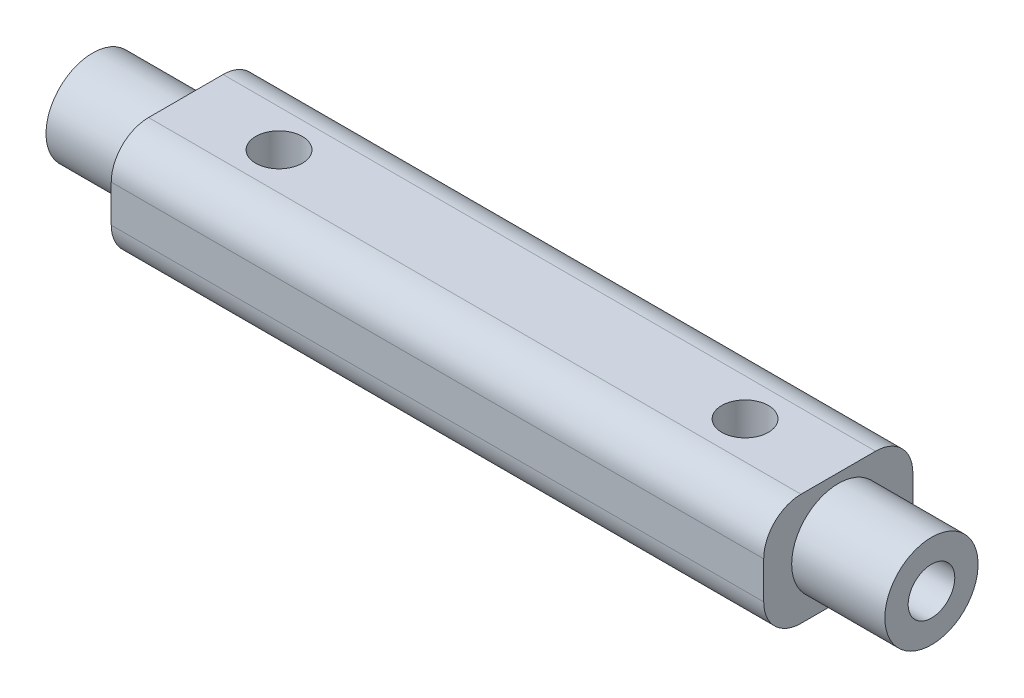
ISO-10303-21;
HEADER;
FILE_DESCRIPTION(('STEP AP214'),'2;1');
FILE_NAME('part.step','',(''),(''),'','','');
FILE_SCHEMA(('AUTOMOTIVE_DESIGN { 1 0 10303 214 1 1 1 1 }'));
ENDSEC;
DATA;
#1=APPLICATION_CONTEXT('core data for automotive mechanical design processes');
#2=APPLICATION_PROTOCOL_DEFINITION('international standard','automotive_design',2000,#1);
#3=PRODUCT_CONTEXT('',#1,'mechanical');
#4=PRODUCT('Part','Part','',(#3));
#5=PRODUCT_RELATED_PRODUCT_CATEGORY('part','',(#4));
#6=PRODUCT_DEFINITION_FORMATION('','',#4);
#7=PRODUCT_DEFINITION_CONTEXT('part definition',#1,'design');
#8=PRODUCT_DEFINITION('design','',#6,#7);
#9=PRODUCT_DEFINITION_SHAPE('','',#8);
#10=(LENGTH_UNIT() NAMED_UNIT(*) SI_UNIT(.MILLI.,.METRE.));
#11=(NAMED_UNIT(*) PLANE_ANGLE_UNIT() SI_UNIT($,.RADIAN.));
#12=(NAMED_UNIT(*) SI_UNIT($,.STERADIAN.) SOLID_ANGLE_UNIT());
#13=UNCERTAINTY_MEASURE_WITH_UNIT(LENGTH_MEASURE(1.E-05),#10,'distance_accuracy_value','');
#14=(GEOMETRIC_REPRESENTATION_CONTEXT(3) GLOBAL_UNCERTAINTY_ASSIGNED_CONTEXT((#13)) GLOBAL_UNIT_ASSIGNED_CONTEXT((#10,
#11,#12)) REPRESENTATION_CONTEXT('',''));
#15=CARTESIAN_POINT('',(0.,0.,0.));
#16=DIRECTION('',(0.,0.,1.));
#17=DIRECTION('',(1.,0.,0.));
#18=AXIS2_PLACEMENT_3D('',#15,#16,#17);
#19=CARTESIAN_POINT('',(22.5,0.,0.));
#20=DIRECTION('',(1.,0.,0.));
#21=DIRECTION('',(0.,0.,-1.));
#22=AXIS2_PLACEMENT_3D('',#19,#20,#21);
#23=CYLINDRICAL_SURFACE('',#22,1.24999999999999);
#24=CARTESIAN_POINT('',(12.5,0.,0.));
#25=DIRECTION('',(0.707106781186547,-0.707106781186547,0.));
#26=DIRECTION('',(0.707106781186547,0.707106781186547,0.));
#27=AXIS2_PLACEMENT_3D('',#24,#25,#26);
#28=ELLIPSE('',#27,1.76776695296635,1.24999999999999);
#29=CARTESIAN_POINT('',(12.5,0.,1.24999999999999));
#30=VERTEX_POINT('',#29);
#31=CARTESIAN_POINT('',(12.5,0.,-1.24999999999999));
#32=VERTEX_POINT('',#31);
#33=EDGE_CURVE('E129',#30,#32,#28,.T.);
#34=ORIENTED_EDGE('',*,*,#33,.T.);
#35=CARTESIAN_POINT('',(12.5,0.,0.));
#36=DIRECTION('',(0.707106781186547,0.707106781186547,0.));
#37=DIRECTION('',(0.707106781186547,-0.707106781186547,0.));
#38=AXIS2_PLACEMENT_3D('',#35,#36,#37);
#39=ELLIPSE('',#38,1.76776695296635,1.24999999999999);
#40=EDGE_CURVE('E126',#32,#30,#39,.T.);
#41=ORIENTED_EDGE('',*,*,#40,.T.);
#42=EDGE_LOOP('',(#34,#41));
#43=FACE_BOUND('',#42,.T.);
#44=CARTESIAN_POINT('',(-12.5,0.,0.));
#45=DIRECTION('',(0.707106781186547,-0.707106781186547,0.));
#46=DIRECTION('',(0.707106781186547,0.707106781186547,0.));
#47=AXIS2_PLACEMENT_3D('',#44,#45,#46);
#48=ELLIPSE('',#47,1.76776695296635,1.24999999999999);
#49=CARTESIAN_POINT('',(-12.5,0.,1.24999999999999));
#50=VERTEX_POINT('',#49);
#51=CARTESIAN_POINT('',(-12.5,0.,-1.24999999999999));
#52=VERTEX_POINT('',#51);
#53=EDGE_CURVE('E48',#50,#52,#48,.F.);
#54=ORIENTED_EDGE('',*,*,#53,.T.);
#55=CARTESIAN_POINT('',(-12.5,0.,0.));
#56=DIRECTION('',(0.707106781186547,0.707106781186547,0.));
#57=DIRECTION('',(0.707106781186547,-0.707106781186547,0.));
#58=AXIS2_PLACEMENT_3D('',#55,#56,#57);
#59=ELLIPSE('',#58,1.76776695296635,1.24999999999999);
#60=EDGE_CURVE('E11',#52,#50,#59,.F.);
#61=ORIENTED_EDGE('',*,*,#60,.T.);
#62=EDGE_LOOP('',(#54,#61));
#63=FACE_BOUND('',#62,.T.);
#64=ADVANCED_FACE('F35',(#43,#63),#23,.F.);
#65=CARTESIAN_POINT('',(22.5,0.,0.));
#66=DIRECTION('',(1.,0.,0.));
#67=DIRECTION('',(0.,0.,-1.));
#68=AXIS2_PLACEMENT_3D('',#65,#66,#67);
#69=CIRCLE('',#68,1.24999999999999);
#70=CARTESIAN_POINT('',(22.5,0.,-1.24999999999999));
#71=VERTEX_POINT('',#70);
#72=EDGE_CURVE('E208',#71,#71,#69,.T.);
#73=ORIENTED_EDGE('',*,*,#72,.T.);
#74=EDGE_LOOP('',(#73));
#75=FACE_BOUND('',#74,.T.);
#76=CARTESIAN_POINT('',(12.5,0.,0.));
#77=DIRECTION('',(0.707106781186547,-0.707106781186547,0.));
#78=DIRECTION('',(0.707106781186547,0.707106781186547,0.));
#79=AXIS2_PLACEMENT_3D('',#76,#77,#78);
#80=ELLIPSE('',#79,1.76776695296635,1.24999999999999);
#81=EDGE_CURVE('E55',#30,#32,#80,.F.);
#82=ORIENTED_EDGE('',*,*,#81,.T.);
#83=CARTESIAN_POINT('',(12.5,0.,0.));
#84=DIRECTION('',(0.707106781186547,0.707106781186547,0.));
#85=DIRECTION('',(0.707106781186547,-0.707106781186547,0.));
#86=AXIS2_PLACEMENT_3D('',#83,#84,#85);
#87=ELLIPSE('',#86,1.76776695296635,1.24999999999999);
#88=EDGE_CURVE('E120',#32,#30,#87,.F.);
#89=ORIENTED_EDGE('',*,*,#88,.T.);
#90=EDGE_LOOP('',(#82,#89));
#91=FACE_BOUND('',#90,.T.);
#92=ADVANCED_FACE('F272',(#75,#91),#23,.F.);
#93=CARTESIAN_POINT('',(17.5,0.,0.));
#94=DIRECTION('',(1.,0.,0.));
#95=DIRECTION('',(0.,0.,-1.));
#96=AXIS2_PLACEMENT_3D('',#93,#94,#95);
#97=PLANE('',#96);
#98=DIRECTION('',(0.,0.,-1.));
#99=VECTOR('',#98,1.);
#100=CARTESIAN_POINT('',(17.5,-3.,4.));
#101=LINE('',#100,#99);
#102=CARTESIAN_POINT('',(17.5,-3.,2.));
#103=VERTEX_POINT('',#102);
#104=CARTESIAN_POINT('',(17.5,-3.,-2.));
#105=VERTEX_POINT('',#104);
#106=EDGE_CURVE('E192',#103,#105,#101,.T.);
#107=ORIENTED_EDGE('',*,*,#106,.T.);
#108=CARTESIAN_POINT('',(17.5,-1.,-2.));
#109=DIRECTION('',(1.,0.,0.));
#110=DIRECTION('',(0.,0.,-1.));
#111=AXIS2_PLACEMENT_3D('',#108,#109,#110);
#112=CIRCLE('',#111,2.);
#113=CARTESIAN_POINT('',(17.5,-1.,-4.));
#114=VERTEX_POINT('',#113);
#115=EDGE_CURVE('E143',#105,#114,#112,.T.);
#116=ORIENTED_EDGE('',*,*,#115,.T.);
#117=DIRECTION('',(0.,1.,0.));
#118=VECTOR('',#117,1.);
#119=CARTESIAN_POINT('',(17.5,3.,-4.));
#120=LINE('',#119,#118);
#121=CARTESIAN_POINT('',(17.5,1.,-4.));
#122=VERTEX_POINT('',#121);
#123=EDGE_CURVE('E189',#114,#122,#120,.T.);
#124=ORIENTED_EDGE('',*,*,#123,.T.);
#125=CARTESIAN_POINT('',(17.5,1.,-2.));
#126=DIRECTION('',(1.,0.,0.));
#127=DIRECTION('',(0.,0.,-1.));
#128=AXIS2_PLACEMENT_3D('',#125,#126,#127);
#129=CIRCLE('',#128,2.);
#130=CARTESIAN_POINT('',(17.5,3.,-2.));
#131=VERTEX_POINT('',#130);
#132=EDGE_CURVE('E145',#122,#131,#129,.T.);
#133=ORIENTED_EDGE('',*,*,#132,.T.);
#134=DIRECTION('',(0.,0.,1.));
#135=VECTOR('',#134,1.);
#136=CARTESIAN_POINT('',(17.5,3.,4.));
#137=LINE('',#136,#135);
#138=CARTESIAN_POINT('',(17.5,3.,2.));
#139=VERTEX_POINT('',#138);
#140=EDGE_CURVE('E172',#131,#139,#137,.T.);
#141=ORIENTED_EDGE('',*,*,#140,.T.);
#142=CARTESIAN_POINT('',(17.5,1.,2.));
#143=DIRECTION('',(1.,0.,0.));
#144=DIRECTION('',(0.,0.,-1.));
#145=AXIS2_PLACEMENT_3D('',#142,#143,#144);
#146=CIRCLE('',#145,2.);
#147=CARTESIAN_POINT('',(17.5,1.,4.));
#148=VERTEX_POINT('',#147);
#149=EDGE_CURVE('E149',#139,#148,#146,.T.);
#150=ORIENTED_EDGE('',*,*,#149,.T.);
#151=DIRECTION('',(0.,-1.,0.));
#152=VECTOR('',#151,1.);
#153=CARTESIAN_POINT('',(17.5,3.,4.));
#154=LINE('',#153,#152);
#155=CARTESIAN_POINT('',(17.5,-1.,4.));
#156=VERTEX_POINT('',#155);
#157=EDGE_CURVE('E176',#148,#156,#154,.T.);
#158=ORIENTED_EDGE('',*,*,#157,.T.);
#159=CARTESIAN_POINT('',(17.5,-1.,2.));
#160=DIRECTION('',(1.,0.,0.));
#161=DIRECTION('',(0.,0.,-1.));
#162=AXIS2_PLACEMENT_3D('',#159,#160,#161);
#163=CIRCLE('',#162,2.);
#164=EDGE_CURVE('E147',#156,#103,#163,.T.);
#165=ORIENTED_EDGE('',*,*,#164,.T.);
#166=EDGE_LOOP('',(#107,#116,#124,#133,#141,#150,#158,#165));
#167=FACE_BOUND('',#166,.T.);
#168=CARTESIAN_POINT('',(17.5,0.,0.));
#169=DIRECTION('',(1.,0.,0.));
#170=DIRECTION('',(0.,0.,-1.));
#171=AXIS2_PLACEMENT_3D('',#168,#169,#170);
#172=CIRCLE('',#171,2.5);
#173=CARTESIAN_POINT('',(17.5,0.,2.5));
#174=VERTEX_POINT('',#173);
#175=EDGE_CURVE('E186',#174,#174,#172,.F.);
#176=ORIENTED_EDGE('',*,*,#175,.T.);
#177=EDGE_LOOP('',(#176));
#178=FACE_BOUND('',#177,.T.);
#179=ADVANCED_FACE('F269',(#167,#178),#97,.T.);
#180=CARTESIAN_POINT('',(-17.5,0.,0.));
#181=DIRECTION('',(1.,0.,0.));
#182=DIRECTION('',(0.,0.,-1.));
#183=AXIS2_PLACEMENT_3D('',#180,#181,#182);
#184=PLANE('',#183);
#185=DIRECTION('',(0.,1.,0.));
#186=VECTOR('',#185,1.);
#187=CARTESIAN_POINT('',(-17.5,3.,-4.));
#188=LINE('',#187,#186);
#189=CARTESIAN_POINT('',(-17.5,-1.,-4.));
#190=VERTEX_POINT('',#189);
#191=CARTESIAN_POINT('',(-17.5,1.,-4.));
#192=VERTEX_POINT('',#191);
#193=EDGE_CURVE('E177',#190,#192,#188,.T.);
#194=ORIENTED_EDGE('',*,*,#193,.F.);
#195=CARTESIAN_POINT('',(-17.5,-1.,-2.));
#196=DIRECTION('',(1.,0.,0.));
#197=DIRECTION('',(0.,0.,-1.));
#198=AXIS2_PLACEMENT_3D('',#195,#196,#197);
#199=CIRCLE('',#198,2.);
#200=CARTESIAN_POINT('',(-17.5,-3.,-2.));
#201=VERTEX_POINT('',#200);
#202=EDGE_CURVE('E156',#190,#201,#199,.F.);
#203=ORIENTED_EDGE('',*,*,#202,.T.);
#204=DIRECTION('',(0.,0.,-1.));
#205=VECTOR('',#204,1.);
#206=CARTESIAN_POINT('',(-17.5,-3.,4.));
#207=LINE('',#206,#205);
#208=CARTESIAN_POINT('',(-17.5,-3.,2.));
#209=VERTEX_POINT('',#208);
#210=EDGE_CURVE('E180',#209,#201,#207,.T.);
#211=ORIENTED_EDGE('',*,*,#210,.F.);
#212=CARTESIAN_POINT('',(-17.5,-1.,2.));
#213=DIRECTION('',(1.,0.,0.));
#214=DIRECTION('',(0.,0.,-1.));
#215=AXIS2_PLACEMENT_3D('',#212,#213,#214);
#216=CIRCLE('',#215,2.);
#217=CARTESIAN_POINT('',(-17.5,-1.,4.));
#218=VERTEX_POINT('',#217);
#219=EDGE_CURVE('E160',#209,#218,#216,.F.);
#220=ORIENTED_EDGE('',*,*,#219,.T.);
#221=DIRECTION('',(0.,-1.,0.));
#222=VECTOR('',#221,1.);
#223=CARTESIAN_POINT('',(-17.5,3.,4.));
#224=LINE('',#223,#222);
#225=CARTESIAN_POINT('',(-17.5,1.,4.));
#226=VERTEX_POINT('',#225);
#227=EDGE_CURVE('E183',#226,#218,#224,.T.);
#228=ORIENTED_EDGE('',*,*,#227,.F.);
#229=CARTESIAN_POINT('',(-17.5,1.,2.));
#230=DIRECTION('',(1.,0.,0.));
#231=DIRECTION('',(0.,0.,-1.));
#232=AXIS2_PLACEMENT_3D('',#229,#230,#231);
#233=CIRCLE('',#232,2.);
#234=CARTESIAN_POINT('',(-17.5,3.,2.));
#235=VERTEX_POINT('',#234);
#236=EDGE_CURVE('E162',#226,#235,#233,.F.);
#237=ORIENTED_EDGE('',*,*,#236,.T.);
#238=DIRECTION('',(0.,0.,1.));
#239=VECTOR('',#238,1.);
#240=CARTESIAN_POINT('',(-17.5,3.,4.));
#241=LINE('',#240,#239);
#242=CARTESIAN_POINT('',(-17.5,3.,-2.));
#243=VERTEX_POINT('',#242);
#244=EDGE_CURVE('E173',#243,#235,#241,.T.);
#245=ORIENTED_EDGE('',*,*,#244,.F.);
#246=CARTESIAN_POINT('',(-17.5,1.,-2.));
#247=DIRECTION('',(1.,0.,0.));
#248=DIRECTION('',(0.,0.,-1.));
#249=AXIS2_PLACEMENT_3D('',#246,#247,#248);
#250=CIRCLE('',#249,2.);
#251=EDGE_CURVE('E158',#243,#192,#250,.F.);
#252=ORIENTED_EDGE('',*,*,#251,.T.);
#253=EDGE_LOOP('',(#194,#203,#211,#220,#228,#237,#245,#252));
#254=FACE_BOUND('',#253,.T.);
#255=CARTESIAN_POINT('',(-17.5,0.,0.));
#256=DIRECTION('',(1.,0.,0.));
#257=DIRECTION('',(0.,0.,-1.));
#258=AXIS2_PLACEMENT_3D('',#255,#256,#257);
#259=CIRCLE('',#258,2.5);
#260=CARTESIAN_POINT('',(-17.5,0.,2.5));
#261=VERTEX_POINT('',#260);
#262=EDGE_CURVE('E169',#261,#261,#259,.F.);
#263=ORIENTED_EDGE('',*,*,#262,.F.);
#264=EDGE_LOOP('',(#263));
#265=FACE_BOUND('',#264,.T.);
#266=ADVANCED_FACE('F245',(#254,#265),#184,.F.);
#267=CARTESIAN_POINT('',(17.5,3.,4.));
#268=DIRECTION('',(0.,0.,-1.));
#269=DIRECTION('',(-1.,0.,0.));
#270=AXIS2_PLACEMENT_3D('',#267,#268,#269);
#271=PLANE('',#270);
#272=ORIENTED_EDGE('',*,*,#227,.T.);
#273=DIRECTION('',(-1.,0.,0.));
#274=VECTOR('',#273,1.);
#275=CARTESIAN_POINT('',(17.5,-1.,4.));
#276=LINE('',#275,#274);
#277=EDGE_CURVE('E133',#218,#156,#276,.F.);
#278=ORIENTED_EDGE('',*,*,#277,.T.);
#279=ORIENTED_EDGE('',*,*,#157,.F.);
#280=DIRECTION('',(-1.,0.,0.));
#281=VECTOR('',#280,1.);
#282=CARTESIAN_POINT('',(17.5,1.,4.));
#283=LINE('',#282,#281);
#284=EDGE_CURVE('E135',#148,#226,#283,.T.);
#285=ORIENTED_EDGE('',*,*,#284,.T.);
#286=EDGE_LOOP('',(#272,#278,#279,#285));
#287=FACE_BOUND('',#286,.T.);
#288=ADVANCED_FACE('F265',(#287),#271,.F.);
#289=CARTESIAN_POINT('',(17.5,-3.,4.));
#290=DIRECTION('',(0.,1.,0.));
#291=DIRECTION('',(0.,0.,1.));
#292=AXIS2_PLACEMENT_3D('',#289,#290,#291);
#293=PLANE('',#292);
#294=CARTESIAN_POINT('',(-12.5,-3.,0.));
#295=DIRECTION('',(0.,1.,0.));
#296=DIRECTION('',(0.,0.,1.));
#297=AXIS2_PLACEMENT_3D('',#294,#295,#296);
#298=CIRCLE('',#297,1.24999999999999);
#299=CARTESIAN_POINT('',(-12.5,-3.,1.24999999999999));
#300=VERTEX_POINT('',#299);
#301=EDGE_CURVE('E217',#300,#300,#298,.T.);
#302=ORIENTED_EDGE('',*,*,#301,.T.);
#303=EDGE_LOOP('',(#302));
#304=FACE_BOUND('',#303,.T.);
#305=CARTESIAN_POINT('',(12.5,-3.,0.));
#306=DIRECTION('',(0.,1.,0.));
#307=DIRECTION('',(0.,0.,1.));
#308=AXIS2_PLACEMENT_3D('',#305,#306,#307);
#309=CIRCLE('',#308,1.24999999999999);
#310=CARTESIAN_POINT('',(12.5,-3.,1.24999999999999));
#311=VERTEX_POINT('',#310);
#312=EDGE_CURVE('E211',#311,#311,#309,.T.);
#313=ORIENTED_EDGE('',*,*,#312,.T.);
#314=EDGE_LOOP('',(#313));
#315=FACE_BOUND('',#314,.T.);
#316=ORIENTED_EDGE('',*,*,#210,.T.);
#317=DIRECTION('',(-1.,0.,0.));
#318=VECTOR('',#317,1.);
#319=CARTESIAN_POINT('',(17.5,-3.,-2.));
#320=LINE('',#319,#318);
#321=EDGE_CURVE('E151',#201,#105,#320,.F.);
#322=ORIENTED_EDGE('',*,*,#321,.T.);
#323=ORIENTED_EDGE('',*,*,#106,.F.);
#324=DIRECTION('',(-1.,0.,0.));
#325=VECTOR('',#324,1.);
#326=CARTESIAN_POINT('',(17.5,-3.,2.));
#327=LINE('',#326,#325);
#328=EDGE_CURVE('E153',#103,#209,#327,.T.);
#329=ORIENTED_EDGE('',*,*,#328,.T.);
#330=EDGE_LOOP('',(#316,#322,#323,#329));
#331=FACE_BOUND('',#330,.T.);
#332=ADVANCED_FACE('F256',(#304,#315,#331),#293,.F.);
#333=CARTESIAN_POINT('',(17.5,3.,-4.));
#334=DIRECTION('',(0.,0.,1.));
#335=DIRECTION('',(1.,0.,0.));
#336=AXIS2_PLACEMENT_3D('',#333,#334,#335);
#337=PLANE('',#336);
#338=ORIENTED_EDGE('',*,*,#123,.F.);
#339=DIRECTION('',(-1.,0.,0.));
#340=VECTOR('',#339,1.);
#341=CARTESIAN_POINT('',(17.5,-1.,-4.));
#342=LINE('',#341,#340);
#343=EDGE_CURVE('E164',#114,#190,#342,.T.);
#344=ORIENTED_EDGE('',*,*,#343,.T.);
#345=ORIENTED_EDGE('',*,*,#193,.T.);
#346=DIRECTION('',(-1.,0.,0.));
#347=VECTOR('',#346,1.);
#348=CARTESIAN_POINT('',(17.5,1.,-4.));
#349=LINE('',#348,#347);
#350=EDGE_CURVE('E167',#192,#122,#349,.F.);
#351=ORIENTED_EDGE('',*,*,#350,.T.);
#352=EDGE_LOOP('',(#338,#344,#345,#351));
#353=FACE_BOUND('',#352,.T.);
#354=ADVANCED_FACE('F229',(#353),#337,.F.);
#355=CARTESIAN_POINT('',(17.5,3.,4.));
#356=DIRECTION('',(0.,-1.,0.));
#357=DIRECTION('',(0.,0.,-1.));
#358=AXIS2_PLACEMENT_3D('',#355,#356,#357);
#359=PLANE('',#358);
#360=CARTESIAN_POINT('',(-12.5,3.,0.));
#361=DIRECTION('',(0.,1.,0.));
#362=DIRECTION('',(0.,0.,1.));
#363=AXIS2_PLACEMENT_3D('',#360,#361,#362);
#364=CIRCLE('',#363,1.24999999999999);
#365=CARTESIAN_POINT('',(-12.5,3.,1.24999999999999));
#366=VERTEX_POINT('',#365);
#367=EDGE_CURVE('E220',#366,#366,#364,.T.);
#368=ORIENTED_EDGE('',*,*,#367,.F.);
#369=EDGE_LOOP('',(#368));
#370=FACE_BOUND('',#369,.T.);
#371=CARTESIAN_POINT('',(12.5,3.,0.));
#372=DIRECTION('',(0.,1.,0.));
#373=DIRECTION('',(0.,0.,1.));
#374=AXIS2_PLACEMENT_3D('',#371,#372,#373);
#375=CIRCLE('',#374,1.24999999999999);
#376=CARTESIAN_POINT('',(12.5,3.,1.24999999999999));
#377=VERTEX_POINT('',#376);
#378=EDGE_CURVE('E214',#377,#377,#375,.T.);
#379=ORIENTED_EDGE('',*,*,#378,.F.);
#380=EDGE_LOOP('',(#379));
#381=FACE_BOUND('',#380,.T.);
#382=ORIENTED_EDGE('',*,*,#140,.F.);
#383=DIRECTION('',(-1.,0.,0.));
#384=VECTOR('',#383,1.);
#385=CARTESIAN_POINT('',(17.5,3.,-2.));
#386=LINE('',#385,#384);
#387=EDGE_CURVE('E138',#131,#243,#386,.T.);
#388=ORIENTED_EDGE('',*,*,#387,.T.);
#389=ORIENTED_EDGE('',*,*,#244,.T.);
#390=DIRECTION('',(-1.,0.,0.));
#391=VECTOR('',#390,1.);
#392=CARTESIAN_POINT('',(17.5,3.,2.));
#393=LINE('',#392,#391);
#394=EDGE_CURVE('E141',#235,#139,#393,.F.);
#395=ORIENTED_EDGE('',*,*,#394,.T.);
#396=EDGE_LOOP('',(#382,#388,#389,#395));
#397=FACE_BOUND('',#396,.T.);
#398=ADVANCED_FACE('F225',(#370,#381,#397),#359,.F.);
#399=CARTESIAN_POINT('',(-22.5,0.,0.));
#400=DIRECTION('',(1.,0.,0.));
#401=DIRECTION('',(0.,0.,-1.));
#402=AXIS2_PLACEMENT_3D('',#399,#400,#401);
#403=PLANE('',#402);
#404=CARTESIAN_POINT('',(-22.5,0.,0.));
#405=DIRECTION('',(1.,0.,0.));
#406=DIRECTION('',(0.,0.,-1.));
#407=AXIS2_PLACEMENT_3D('',#404,#405,#406);
#408=CIRCLE('',#407,1.24999999999999);
#409=CARTESIAN_POINT('',(-22.5,0.,-1.24999999999999));
#410=VERTEX_POINT('',#409);
#411=EDGE_CURVE('E203',#410,#410,#408,.T.);
#412=ORIENTED_EDGE('',*,*,#411,.T.);
#413=EDGE_LOOP('',(#412));
#414=FACE_BOUND('',#413,.T.);
#415=CARTESIAN_POINT('',(-22.5,0.,0.));
#416=DIRECTION('',(1.,0.,0.));
#417=DIRECTION('',(0.,0.,-1.));
#418=AXIS2_PLACEMENT_3D('',#415,#416,#417);
#419=CIRCLE('',#418,2.5);
#420=CARTESIAN_POINT('',(-22.5,0.,2.5));
#421=VERTEX_POINT('',#420);
#422=EDGE_CURVE('E200',#421,#421,#419,.T.);
#423=ORIENTED_EDGE('',*,*,#422,.F.);
#424=EDGE_LOOP('',(#423));
#425=FACE_BOUND('',#424,.T.);
#426=ADVANCED_FACE('F228',(#414,#425),#403,.F.);
#427=CARTESIAN_POINT('',(22.5,0.,0.));
#428=DIRECTION('',(-1.,0.,0.));
#429=DIRECTION('',(0.,0.,1.));
#430=AXIS2_PLACEMENT_3D('',#427,#428,#429);
#431=CYLINDRICAL_SURFACE('',#430,2.5);
#432=CARTESIAN_POINT('',(-22.5,0.,2.5));
#433=CARTESIAN_POINT('',(-22.4479166666667,0.,2.5));
#434=CARTESIAN_POINT('',(-22.3958333333333,0.,2.5));
#435=CARTESIAN_POINT('',(-22.2916666666667,0.,2.5));
#436=CARTESIAN_POINT('',(-22.2395833333333,0.,2.5));
#437=CARTESIAN_POINT('',(-22.1354166666667,0.,2.5));
#438=CARTESIAN_POINT('',(-22.0833333333333,0.,2.5));
#439=CARTESIAN_POINT('',(-21.9791666666667,0.,2.5));
#440=CARTESIAN_POINT('',(-21.9270833333333,0.,2.5));
#441=CARTESIAN_POINT('',(-21.8229166666667,0.,2.5));
#442=CARTESIAN_POINT('',(-21.7708333333333,0.,2.5));
#443=CARTESIAN_POINT('',(-21.6666666666667,0.,2.5));
#444=CARTESIAN_POINT('',(-21.6145833333333,0.,2.5));
#445=CARTESIAN_POINT('',(-21.5104166666667,0.,2.5));
#446=CARTESIAN_POINT('',(-21.4583333333333,0.,2.5));
#447=CARTESIAN_POINT('',(-21.3541666666667,0.,2.5));
#448=CARTESIAN_POINT('',(-21.3020833333333,0.,2.5));
#449=CARTESIAN_POINT('',(-21.1979166666667,0.,2.5));
#450=CARTESIAN_POINT('',(-21.1458333333333,0.,2.5));
#451=CARTESIAN_POINT('',(-21.0416666666667,0.,2.5));
#452=CARTESIAN_POINT('',(-20.9895833333333,0.,2.5));
#453=CARTESIAN_POINT('',(-20.8854166666667,0.,2.5));
#454=CARTESIAN_POINT('',(-20.8333333333333,0.,2.5));
#455=CARTESIAN_POINT('',(-20.7291666666667,0.,2.5));
#456=CARTESIAN_POINT('',(-20.6770833333333,0.,2.5));
#457=CARTESIAN_POINT('',(-20.5729166666667,0.,2.5));
#458=CARTESIAN_POINT('',(-20.5208333333333,0.,2.5));
#459=CARTESIAN_POINT('',(-20.4166666666667,0.,2.5));
#460=CARTESIAN_POINT('',(-20.3645833333333,0.,2.5));
#461=CARTESIAN_POINT('',(-20.2604166666667,0.,2.5));
#462=CARTESIAN_POINT('',(-20.2083333333333,0.,2.5));
#463=CARTESIAN_POINT('',(-20.1041666666667,0.,2.5));
#464=CARTESIAN_POINT('',(-20.0520833333333,0.,2.5));
#465=CARTESIAN_POINT('',(-19.9479166666667,0.,2.5));
#466=CARTESIAN_POINT('',(-19.8958333333333,0.,2.5));
#467=CARTESIAN_POINT('',(-19.7916666666667,0.,2.5));
#468=CARTESIAN_POINT('',(-19.7395833333333,0.,2.5));
#469=CARTESIAN_POINT('',(-19.6354166666667,0.,2.5));
#470=CARTESIAN_POINT('',(-19.5833333333333,0.,2.5));
#471=CARTESIAN_POINT('',(-19.4791666666667,0.,2.5));
#472=CARTESIAN_POINT('',(-19.4270833333333,0.,2.5));
#473=CARTESIAN_POINT('',(-19.3229166666667,0.,2.5));
#474=CARTESIAN_POINT('',(-19.2708333333333,0.,2.5));
#475=CARTESIAN_POINT('',(-19.1666666666667,0.,2.5));
#476=CARTESIAN_POINT('',(-19.1145833333333,0.,2.5));
#477=CARTESIAN_POINT('',(-19.0104166666667,0.,2.5));
#478=CARTESIAN_POINT('',(-18.9583333333333,0.,2.5));
#479=CARTESIAN_POINT('',(-18.8541666666667,0.,2.5));
#480=CARTESIAN_POINT('',(-18.8020833333333,0.,2.5));
#481=CARTESIAN_POINT('',(-18.6979166666667,0.,2.5));
#482=CARTESIAN_POINT('',(-18.6458333333333,0.,2.5));
#483=CARTESIAN_POINT('',(-18.5416666666667,0.,2.5));
#484=CARTESIAN_POINT('',(-18.4895833333333,0.,2.5));
#485=CARTESIAN_POINT('',(-18.3854166666667,0.,2.5));
#486=CARTESIAN_POINT('',(-18.3333333333333,0.,2.5));
#487=CARTESIAN_POINT('',(-18.2291666666667,0.,2.5));
#488=CARTESIAN_POINT('',(-18.1770833333333,0.,2.5));
#489=CARTESIAN_POINT('',(-18.0729166666667,0.,2.5));
#490=CARTESIAN_POINT('',(-18.0208333333333,0.,2.5));
#491=CARTESIAN_POINT('',(-17.9166666666667,0.,2.5));
#492=CARTESIAN_POINT('',(-17.8645833333333,0.,2.5));
#493=CARTESIAN_POINT('',(-17.7604166666667,0.,2.5));
#494=CARTESIAN_POINT('',(-17.7083333333333,0.,2.5));
#495=CARTESIAN_POINT('',(-17.6041666666667,0.,2.5));
#496=CARTESIAN_POINT('',(-17.5520833333333,0.,2.5));
#497=CARTESIAN_POINT('',(-17.5,0.,2.5));
#498=B_SPLINE_CURVE_WITH_KNOTS('',3,(#432,#433,#434,#435,#436,#437,#438,#439,#440,#441,#442,
#443,#444,#445,#446,#447,#448,#449,#450,#451,#452,#453,#454,#455,#456,#457,#458,#459,#460,#461,
#462,#463,#464,#465,#466,#467,#468,#469,#470,#471,#472,#473,#474,#475,#476,#477,#478,#479,#480,
#481,#482,#483,#484,#485,#486,#487,#488,#489,#490,#491,#492,#493,#494,#495,#496,#497),
.UNSPECIFIED.,.F.,.F.,(4,2,2,2,2,2,2,2,2,2,2,2,2,2,2,2,2,2,2,2,2,2,2,2,2,2,2,2,2,2,2,2,4),(0.,
0.156249999999997,0.3125,0.468750000000004,0.625000000000001,0.781249999999997,
0.937500000000001,1.09375,1.25,1.40625,1.5625,1.71875,1.875,2.03125,2.1875,2.34375000000001,2.5,
2.65625,2.8125,2.96875000000001,3.125,3.28125,3.4375,3.59375000000001,3.75,3.90625,4.0625,
4.21875000000001,4.375,4.53125,4.6875,4.84375000000001,5.),.UNSPECIFIED.);
#499=EDGE_CURVE('BSEAM280',#421,#261,#498,.T.);
#500=ORIENTED_EDGE('',*,*,#422,.T.);
#501=ORIENTED_EDGE('',*,*,#262,.T.);
#502=ORIENTED_EDGE('',*,*,#499,.T.);
#503=ORIENTED_EDGE('',*,*,#499,.F.);
#504=EDGE_LOOP('',(#500,#502,#501,#503));
#505=FACE_BOUND('',#504,.T.);
#506=ADVANCED_FACE('F280',(#505),#431,.T.);
#507=CARTESIAN_POINT('',(22.5,0.,0.));
#508=DIRECTION('',(1.,0.,0.));
#509=DIRECTION('',(0.,0.,-1.));
#510=AXIS2_PLACEMENT_3D('',#507,#508,#509);
#511=CIRCLE('',#510,2.5);
#512=CARTESIAN_POINT('',(22.5,0.,2.5));
#513=VERTEX_POINT('',#512);
#514=EDGE_CURVE('E199',#513,#513,#511,.T.);
#515=CARTESIAN_POINT('',(17.5,0.,2.5));
#516=CARTESIAN_POINT('',(17.5520833333333,0.,2.5));
#517=CARTESIAN_POINT('',(17.6041666666667,0.,2.5));
#518=CARTESIAN_POINT('',(17.7083333333333,0.,2.5));
#519=CARTESIAN_POINT('',(17.7604166666667,0.,2.5));
#520=CARTESIAN_POINT('',(17.8645833333333,0.,2.5));
#521=CARTESIAN_POINT('',(17.9166666666667,0.,2.5));
#522=CARTESIAN_POINT('',(18.0208333333333,0.,2.5));
#523=CARTESIAN_POINT('',(18.0729166666667,0.,2.5));
#524=CARTESIAN_POINT('',(18.1770833333333,0.,2.5));
#525=CARTESIAN_POINT('',(18.2291666666667,0.,2.5));
#526=CARTESIAN_POINT('',(18.3333333333333,0.,2.5));
#527=CARTESIAN_POINT('',(18.3854166666667,0.,2.5));
#528=CARTESIAN_POINT('',(18.4895833333333,0.,2.5));
#529=CARTESIAN_POINT('',(18.5416666666667,0.,2.5));
#530=CARTESIAN_POINT('',(18.6458333333333,0.,2.5));
#531=CARTESIAN_POINT('',(18.6979166666667,0.,2.5));
#532=CARTESIAN_POINT('',(18.8020833333333,0.,2.5));
#533=CARTESIAN_POINT('',(18.8541666666667,0.,2.5));
#534=CARTESIAN_POINT('',(18.9583333333333,0.,2.5));
#535=CARTESIAN_POINT('',(19.0104166666667,0.,2.5));
#536=CARTESIAN_POINT('',(19.1145833333333,0.,2.5));
#537=CARTESIAN_POINT('',(19.1666666666667,0.,2.5));
#538=CARTESIAN_POINT('',(19.2708333333333,0.,2.5));
#539=CARTESIAN_POINT('',(19.3229166666667,0.,2.5));
#540=CARTESIAN_POINT('',(19.4270833333333,0.,2.5));
#541=CARTESIAN_POINT('',(19.4791666666667,0.,2.5));
#542=CARTESIAN_POINT('',(19.5833333333333,0.,2.5));
#543=CARTESIAN_POINT('',(19.6354166666667,0.,2.5));
#544=CARTESIAN_POINT('',(19.7395833333333,0.,2.5));
#545=CARTESIAN_POINT('',(19.7916666666667,0.,2.5));
#546=CARTESIAN_POINT('',(19.8958333333333,0.,2.5));
#547=CARTESIAN_POINT('',(19.9479166666667,0.,2.5));
#548=CARTESIAN_POINT('',(20.0520833333333,0.,2.5));
#549=CARTESIAN_POINT('',(20.1041666666667,0.,2.5));
#550=CARTESIAN_POINT('',(20.2083333333333,0.,2.5));
#551=CARTESIAN_POINT('',(20.2604166666667,0.,2.5));
#552=CARTESIAN_POINT('',(20.3645833333333,0.,2.5));
#553=CARTESIAN_POINT('',(20.4166666666667,0.,2.5));
#554=CARTESIAN_POINT('',(20.5208333333333,0.,2.5));
#555=CARTESIAN_POINT('',(20.5729166666667,0.,2.5));
#556=CARTESIAN_POINT('',(20.6770833333333,0.,2.5));
#557=CARTESIAN_POINT('',(20.7291666666667,0.,2.5));
#558=CARTESIAN_POINT('',(20.8333333333333,0.,2.5));
#559=CARTESIAN_POINT('',(20.8854166666667,0.,2.5));
#560=CARTESIAN_POINT('',(20.9895833333333,0.,2.5));
#561=CARTESIAN_POINT('',(21.0416666666667,0.,2.5));
#562=CARTESIAN_POINT('',(21.1458333333333,0.,2.5));
#563=CARTESIAN_POINT('',(21.1979166666667,0.,2.5));
#564=CARTESIAN_POINT('',(21.3020833333333,0.,2.5));
#565=CARTESIAN_POINT('',(21.3541666666667,0.,2.5));
#566=CARTESIAN_POINT('',(21.4583333333333,0.,2.5));
#567=CARTESIAN_POINT('',(21.5104166666667,0.,2.5));
#568=CARTESIAN_POINT('',(21.6145833333333,0.,2.5));
#569=CARTESIAN_POINT('',(21.6666666666667,0.,2.5));
#570=CARTESIAN_POINT('',(21.7708333333333,0.,2.5));
#571=CARTESIAN_POINT('',(21.8229166666667,0.,2.5));
#572=CARTESIAN_POINT('',(21.9270833333333,0.,2.5));
#573=CARTESIAN_POINT('',(21.9791666666667,0.,2.5));
#574=CARTESIAN_POINT('',(22.0833333333333,0.,2.5));
#575=CARTESIAN_POINT('',(22.1354166666667,0.,2.5));
#576=CARTESIAN_POINT('',(22.2395833333333,0.,2.5));
#577=CARTESIAN_POINT('',(22.2916666666667,0.,2.5));
#578=CARTESIAN_POINT('',(22.3958333333333,0.,2.5));
#579=CARTESIAN_POINT('',(22.4479166666667,0.,2.5));
#580=CARTESIAN_POINT('',(22.5,0.,2.5));
#581=B_SPLINE_CURVE_WITH_KNOTS('',3,(#515,#516,#517,#518,#519,#520,#521,#522,#523,#524,#525,
#526,#527,#528,#529,#530,#531,#532,#533,#534,#535,#536,#537,#538,#539,#540,#541,#542,#543,#544,
#545,#546,#547,#548,#549,#550,#551,#552,#553,#554,#555,#556,#557,#558,#559,#560,#561,#562,#563,
#564,#565,#566,#567,#568,#569,#570,#571,#572,#573,#574,#575,#576,#577,#578,#579,#580),
.UNSPECIFIED.,.F.,.F.,(4,2,2,2,2,2,2,2,2,2,2,2,2,2,2,2,2,2,2,2,2,2,2,2,2,2,2,2,2,2,2,2,4),(0.,
0.15625,0.3125,0.46875,0.625000000000001,0.781250000000001,0.937500000000001,1.09375,1.25,
1.40625,1.5625,1.71875,1.875,2.03125,2.1875,2.34375,2.5,2.65625,2.8125,2.96875,3.125,3.28125,
3.4375,3.59375,3.75,3.90625,4.0625,4.21875,4.375,4.53125,4.6875,4.84375,5.),.UNSPECIFIED.);
#582=EDGE_CURVE('BSEAM276',#174,#513,#581,.T.);
#583=ORIENTED_EDGE('',*,*,#175,.F.);
#584=ORIENTED_EDGE('',*,*,#514,.F.);
#585=ORIENTED_EDGE('',*,*,#582,.T.);
#586=ORIENTED_EDGE('',*,*,#582,.F.);
#587=EDGE_LOOP('',(#583,#585,#584,#586));
#588=FACE_BOUND('',#587,.T.);
#589=ADVANCED_FACE('F276',(#588),#431,.T.);
#590=CARTESIAN_POINT('',(22.5,0.,0.));
#591=DIRECTION('',(1.,0.,0.));
#592=DIRECTION('',(0.,0.,-1.));
#593=AXIS2_PLACEMENT_3D('',#590,#591,#592);
#594=PLANE('',#593);
#595=ORIENTED_EDGE('',*,*,#72,.F.);
#596=EDGE_LOOP('',(#595));
#597=FACE_BOUND('',#596,.T.);
#598=ORIENTED_EDGE('',*,*,#514,.T.);
#599=EDGE_LOOP('',(#598));
#600=FACE_BOUND('',#599,.T.);
#601=ADVANCED_FACE('F279',(#597,#600),#594,.T.);
#602=CARTESIAN_POINT('',(17.5,-1.,-2.));
#603=DIRECTION('',(-1.,0.,0.));
#604=DIRECTION('',(0.,0.,1.));
#605=AXIS2_PLACEMENT_3D('',#602,#603,#604);
#606=CYLINDRICAL_SURFACE('',#605,2.);
#607=ORIENTED_EDGE('',*,*,#115,.F.);
#608=ORIENTED_EDGE('',*,*,#321,.F.);
#609=ORIENTED_EDGE('',*,*,#202,.F.);
#610=ORIENTED_EDGE('',*,*,#343,.F.);
#611=EDGE_LOOP('',(#607,#608,#609,#610));
#612=FACE_BOUND('',#611,.T.);
#613=ADVANCED_FACE('F252',(#612),#606,.T.);
#614=CARTESIAN_POINT('',(17.5,1.,-2.));
#615=DIRECTION('',(-1.,0.,0.));
#616=DIRECTION('',(0.,0.,1.));
#617=AXIS2_PLACEMENT_3D('',#614,#615,#616);
#618=CYLINDRICAL_SURFACE('',#617,2.);
#619=ORIENTED_EDGE('',*,*,#132,.F.);
#620=ORIENTED_EDGE('',*,*,#350,.F.);
#621=ORIENTED_EDGE('',*,*,#251,.F.);
#622=ORIENTED_EDGE('',*,*,#387,.F.);
#623=EDGE_LOOP('',(#619,#620,#621,#622));
#624=FACE_BOUND('',#623,.T.);
#625=ADVANCED_FACE('F241',(#624),#618,.T.);
#626=CARTESIAN_POINT('',(17.5,-1.,2.));
#627=DIRECTION('',(-1.,0.,0.));
#628=DIRECTION('',(0.,0.,1.));
#629=AXIS2_PLACEMENT_3D('',#626,#627,#628);
#630=CYLINDRICAL_SURFACE('',#629,2.);
#631=ORIENTED_EDGE('',*,*,#164,.F.);
#632=ORIENTED_EDGE('',*,*,#277,.F.);
#633=ORIENTED_EDGE('',*,*,#219,.F.);
#634=ORIENTED_EDGE('',*,*,#328,.F.);
#635=EDGE_LOOP('',(#631,#632,#633,#634));
#636=FACE_BOUND('',#635,.T.);
#637=ADVANCED_FACE('F261',(#636),#630,.T.);
#638=CARTESIAN_POINT('',(17.5,1.,2.));
#639=DIRECTION('',(-1.,0.,0.));
#640=DIRECTION('',(0.,0.,1.));
#641=AXIS2_PLACEMENT_3D('',#638,#639,#640);
#642=CYLINDRICAL_SURFACE('',#641,2.);
#643=ORIENTED_EDGE('',*,*,#149,.F.);
#644=ORIENTED_EDGE('',*,*,#394,.F.);
#645=ORIENTED_EDGE('',*,*,#236,.F.);
#646=ORIENTED_EDGE('',*,*,#284,.F.);
#647=EDGE_LOOP('',(#643,#644,#645,#646));
#648=FACE_BOUND('',#647,.T.);
#649=ADVANCED_FACE('F37',(#648),#642,.T.);
#650=CARTESIAN_POINT('',(-12.5,0.,0.));
#651=DIRECTION('',(0.707106781186547,-0.707106781186547,0.));
#652=DIRECTION('',(0.707106781186547,0.707106781186547,0.));
#653=AXIS2_PLACEMENT_3D('',#650,#651,#652);
#654=ELLIPSE('',#653,1.76776695296635,1.24999999999999);
#655=EDGE_CURVE('E113',#50,#52,#654,.T.);
#656=ORIENTED_EDGE('',*,*,#655,.T.);
#657=CARTESIAN_POINT('',(-12.5,0.,0.));
#658=DIRECTION('',(0.707106781186547,0.707106781186547,0.));
#659=DIRECTION('',(0.707106781186547,-0.707106781186547,0.));
#660=AXIS2_PLACEMENT_3D('',#657,#658,#659);
#661=ELLIPSE('',#660,1.76776695296635,1.24999999999999);
#662=EDGE_CURVE('E43',#52,#50,#661,.T.);
#663=ORIENTED_EDGE('',*,*,#662,.T.);
#664=EDGE_LOOP('',(#656,#663));
#665=FACE_BOUND('',#664,.T.);
#666=ORIENTED_EDGE('',*,*,#411,.F.);
#667=EDGE_LOOP('',(#666));
#668=FACE_BOUND('',#667,.T.);
#669=ADVANCED_FACE('F122',(#665,#668),#23,.F.);
#670=CARTESIAN_POINT('',(12.5,3.,0.));
#671=DIRECTION('',(0.,1.,0.));
#672=DIRECTION('',(0.,0.,1.));
#673=AXIS2_PLACEMENT_3D('',#670,#671,#672);
#674=CYLINDRICAL_SURFACE('',#673,1.24999999999999);
#675=ORIENTED_EDGE('',*,*,#378,.T.);
#676=EDGE_LOOP('',(#675));
#677=FACE_BOUND('',#676,.T.);
#678=ORIENTED_EDGE('',*,*,#81,.F.);
#679=ORIENTED_EDGE('',*,*,#40,.F.);
#680=EDGE_LOOP('',(#678,#679));
#681=FACE_BOUND('',#680,.T.);
#682=ADVANCED_FACE('F302',(#677,#681),#674,.F.);
#683=ORIENTED_EDGE('',*,*,#312,.F.);
#684=EDGE_LOOP('',(#683));
#685=FACE_BOUND('',#684,.T.);
#686=ORIENTED_EDGE('',*,*,#33,.F.);
#687=ORIENTED_EDGE('',*,*,#88,.F.);
#688=EDGE_LOOP('',(#686,#687));
#689=FACE_BOUND('',#688,.T.);
#690=ADVANCED_FACE('F307',(#685,#689),#674,.F.);
#691=CARTESIAN_POINT('',(-12.5,3.,0.));
#692=DIRECTION('',(0.,1.,0.));
#693=DIRECTION('',(0.,0.,1.));
#694=AXIS2_PLACEMENT_3D('',#691,#692,#693);
#695=CYLINDRICAL_SURFACE('',#694,1.24999999999999);
#696=ORIENTED_EDGE('',*,*,#367,.T.);
#697=EDGE_LOOP('',(#696));
#698=FACE_BOUND('',#697,.T.);
#699=ORIENTED_EDGE('',*,*,#53,.F.);
#700=ORIENTED_EDGE('',*,*,#662,.F.);
#701=EDGE_LOOP('',(#699,#700));
#702=FACE_BOUND('',#701,.T.);
#703=ADVANCED_FACE('F119',(#698,#702),#695,.F.);
#704=ORIENTED_EDGE('',*,*,#301,.F.);
#705=EDGE_LOOP('',(#704));
#706=FACE_BOUND('',#705,.T.);
#707=ORIENTED_EDGE('',*,*,#655,.F.);
#708=ORIENTED_EDGE('',*,*,#60,.F.);
#709=EDGE_LOOP('',(#707,#708));
#710=FACE_BOUND('',#709,.T.);
#711=ADVANCED_FACE('F114',(#706,#710),#695,.F.);
#712=CLOSED_SHELL('',(#64,#92,#179,#266,#288,#332,#354,#398,#426,#506,#589,#601,#613,#625,#637,
#649,#669,#682,#690,#703,#711));
#713=MANIFOLD_SOLID_BREP('B2',#712);
#714=ADVANCED_BREP_SHAPE_REPRESENTATION('',(#18,#713),#14);
#715=SHAPE_DEFINITION_REPRESENTATION(#9,#714);
ENDSEC;
END-ISO-10303-21;
